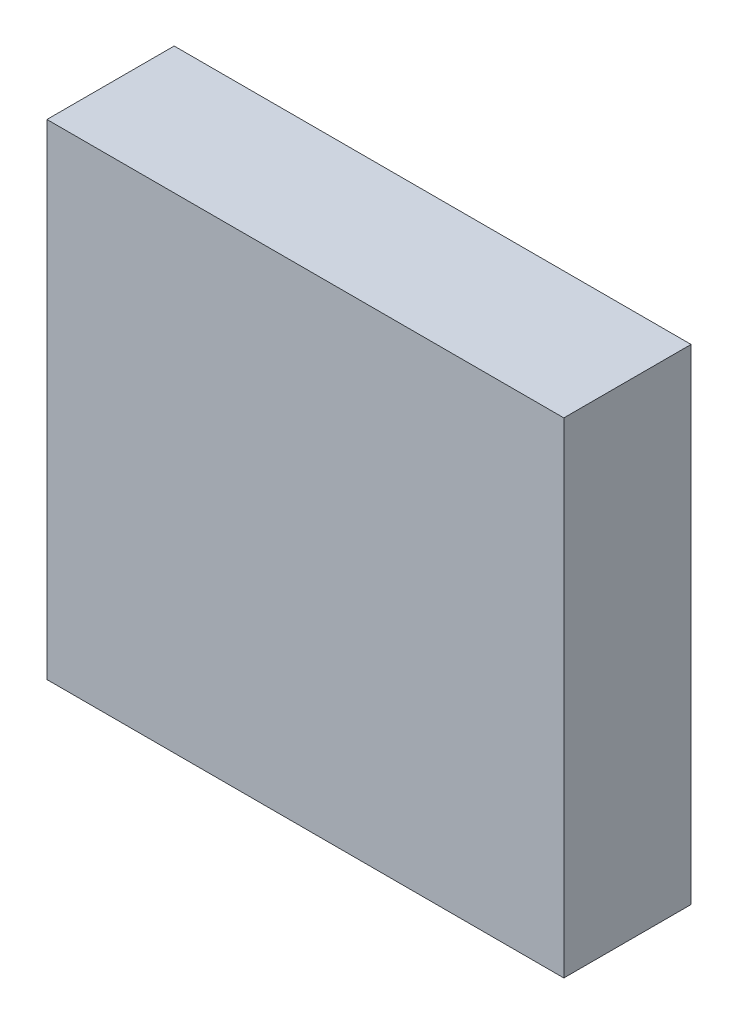
ISO-10303-21;
HEADER;
FILE_DESCRIPTION(('STEP AP214'),'2;1');
FILE_NAME('part.step','',(''),(''),'','','');
FILE_SCHEMA(('AUTOMOTIVE_DESIGN { 1 0 10303 214 1 1 1 1 }'));
ENDSEC;
DATA;
#1=APPLICATION_CONTEXT('core data for automotive mechanical design processes');
#2=APPLICATION_PROTOCOL_DEFINITION('international standard','automotive_design',2000,#1);
#3=PRODUCT_CONTEXT('',#1,'mechanical');
#4=PRODUCT('Part','Part','',(#3));
#5=PRODUCT_RELATED_PRODUCT_CATEGORY('part','',(#4));
#6=PRODUCT_DEFINITION_FORMATION('','',#4);
#7=PRODUCT_DEFINITION_CONTEXT('part definition',#1,'design');
#8=PRODUCT_DEFINITION('design','',#6,#7);
#9=PRODUCT_DEFINITION_SHAPE('','',#8);
#10=(LENGTH_UNIT() NAMED_UNIT(*) SI_UNIT(.MILLI.,.METRE.));
#11=(NAMED_UNIT(*) PLANE_ANGLE_UNIT() SI_UNIT($,.RADIAN.));
#12=(NAMED_UNIT(*) SI_UNIT($,.STERADIAN.) SOLID_ANGLE_UNIT());
#13=UNCERTAINTY_MEASURE_WITH_UNIT(LENGTH_MEASURE(1.E-05),#10,'distance_accuracy_value','');
#14=(GEOMETRIC_REPRESENTATION_CONTEXT(3) GLOBAL_UNCERTAINTY_ASSIGNED_CONTEXT((#13)) GLOBAL_UNIT_ASSIGNED_CONTEXT((#10,
#11,#12)) REPRESENTATION_CONTEXT('',''));
#15=CARTESIAN_POINT('',(0.,0.,0.));
#16=DIRECTION('',(0.,0.,1.));
#17=DIRECTION('',(1.,0.,0.));
#18=AXIS2_PLACEMENT_3D('',#15,#16,#17);
#19=CARTESIAN_POINT('',(-1.625,1.525,0.8));
#20=DIRECTION('',(1.,0.,0.));
#21=DIRECTION('',(0.,0.,-1.));
#22=AXIS2_PLACEMENT_3D('',#19,#20,#21);
#23=PLANE('',#22);
#24=DIRECTION('',(0.,-1.,0.));
#25=VECTOR('',#24,1.);
#26=CARTESIAN_POINT('',(-1.625,1.525,0.));
#27=LINE('',#26,#25);
#28=CARTESIAN_POINT('',(-1.625,1.525,0.));
#29=VERTEX_POINT('',#28);
#30=CARTESIAN_POINT('',(-1.625,-1.525,0.));
#31=VERTEX_POINT('',#30);
#32=EDGE_CURVE('E97',#29,#31,#27,.T.);
#33=ORIENTED_EDGE('',*,*,#32,.T.);
#34=DIRECTION('',(0.,0.,-1.));
#35=VECTOR('',#34,1.);
#36=CARTESIAN_POINT('',(-1.625,-1.525,0.8));
#37=LINE('',#36,#35);
#38=CARTESIAN_POINT('',(-1.625,-1.525,0.8));
#39=VERTEX_POINT('',#38);
#40=EDGE_CURVE('E11',#39,#31,#37,.T.);
#41=ORIENTED_EDGE('',*,*,#40,.F.);
#42=DIRECTION('',(0.,-1.,0.));
#43=VECTOR('',#42,1.);
#44=CARTESIAN_POINT('',(-1.625,1.525,0.8));
#45=LINE('',#44,#43);
#46=CARTESIAN_POINT('',(-1.625,1.525,0.8));
#47=VERTEX_POINT('',#46);
#48=EDGE_CURVE('E85',#47,#39,#45,.T.);
#49=ORIENTED_EDGE('',*,*,#48,.F.);
#50=DIRECTION('',(0.,0.,-1.));
#51=VECTOR('',#50,1.);
#52=CARTESIAN_POINT('',(-1.625,1.525,0.8));
#53=LINE('',#52,#51);
#54=EDGE_CURVE('E93',#47,#29,#53,.T.);
#55=ORIENTED_EDGE('',*,*,#54,.T.);
#56=EDGE_LOOP('',(#33,#41,#49,#55));
#57=FACE_BOUND('',#56,.T.);
#58=ADVANCED_FACE('F34',(#57),#23,.F.);
#59=CARTESIAN_POINT('',(-1.625,-1.525,0.8));
#60=DIRECTION('',(0.,1.,0.));
#61=DIRECTION('',(0.,0.,1.));
#62=AXIS2_PLACEMENT_3D('',#59,#60,#61);
#63=PLANE('',#62);
#64=DIRECTION('',(1.,0.,0.));
#65=VECTOR('',#64,1.);
#66=CARTESIAN_POINT('',(-1.625,-1.525,0.));
#67=LINE('',#66,#65);
#68=CARTESIAN_POINT('',(1.625,-1.525,0.));
#69=VERTEX_POINT('',#68);
#70=EDGE_CURVE('E89',#31,#69,#67,.T.);
#71=ORIENTED_EDGE('',*,*,#70,.T.);
#72=DIRECTION('',(0.,0.,-1.));
#73=VECTOR('',#72,1.);
#74=CARTESIAN_POINT('',(1.625,-1.525,0.8));
#75=LINE('',#74,#73);
#76=CARTESIAN_POINT('',(1.625,-1.525,0.8));
#77=VERTEX_POINT('',#76);
#78=EDGE_CURVE('E42',#77,#69,#75,.T.);
#79=ORIENTED_EDGE('',*,*,#78,.F.);
#80=DIRECTION('',(1.,0.,0.));
#81=VECTOR('',#80,1.);
#82=CARTESIAN_POINT('',(-1.625,-1.525,0.8));
#83=LINE('',#82,#81);
#84=EDGE_CURVE('E80',#39,#77,#83,.T.);
#85=ORIENTED_EDGE('',*,*,#84,.F.);
#86=ORIENTED_EDGE('',*,*,#40,.T.);
#87=EDGE_LOOP('',(#71,#79,#85,#86));
#88=FACE_BOUND('',#87,.T.);
#89=ADVANCED_FACE('F88',(#88),#63,.F.);
#90=CARTESIAN_POINT('',(1.625,-1.525,0.8));
#91=DIRECTION('',(-1.,0.,0.));
#92=DIRECTION('',(0.,0.,1.));
#93=AXIS2_PLACEMENT_3D('',#90,#91,#92);
#94=PLANE('',#93);
#95=DIRECTION('',(0.,1.,0.));
#96=VECTOR('',#95,1.);
#97=CARTESIAN_POINT('',(1.625,-1.525,0.));
#98=LINE('',#97,#96);
#99=CARTESIAN_POINT('',(1.625,1.525,0.));
#100=VERTEX_POINT('',#99);
#101=EDGE_CURVE('E67',#69,#100,#98,.T.);
#102=ORIENTED_EDGE('',*,*,#101,.T.);
#103=DIRECTION('',(0.,0.,-1.));
#104=VECTOR('',#103,1.);
#105=CARTESIAN_POINT('',(1.625,1.525,0.8));
#106=LINE('',#105,#104);
#107=CARTESIAN_POINT('',(1.625,1.525,0.8));
#108=VERTEX_POINT('',#107);
#109=EDGE_CURVE('E90',#108,#100,#106,.T.);
#110=ORIENTED_EDGE('',*,*,#109,.F.);
#111=DIRECTION('',(0.,1.,0.));
#112=VECTOR('',#111,1.);
#113=CARTESIAN_POINT('',(1.625,-1.525,0.8));
#114=LINE('',#113,#112);
#115=EDGE_CURVE('E83',#77,#108,#114,.T.);
#116=ORIENTED_EDGE('',*,*,#115,.F.);
#117=ORIENTED_EDGE('',*,*,#78,.T.);
#118=EDGE_LOOP('',(#102,#110,#116,#117));
#119=FACE_BOUND('',#118,.T.);
#120=ADVANCED_FACE('F91',(#119),#94,.F.);
#121=CARTESIAN_POINT('',(1.625,1.525,0.8));
#122=DIRECTION('',(0.,-1.,0.));
#123=DIRECTION('',(0.,0.,-1.));
#124=AXIS2_PLACEMENT_3D('',#121,#122,#123);
#125=PLANE('',#124);
#126=DIRECTION('',(-1.,0.,0.));
#127=VECTOR('',#126,1.);
#128=CARTESIAN_POINT('',(1.625,1.525,0.));
#129=LINE('',#128,#127);
#130=EDGE_CURVE('E73',#100,#29,#129,.T.);
#131=ORIENTED_EDGE('',*,*,#130,.T.);
#132=ORIENTED_EDGE('',*,*,#54,.F.);
#133=DIRECTION('',(-1.,0.,0.));
#134=VECTOR('',#133,1.);
#135=CARTESIAN_POINT('',(1.625,1.525,0.8));
#136=LINE('',#135,#134);
#137=EDGE_CURVE('E50',#108,#47,#136,.T.);
#138=ORIENTED_EDGE('',*,*,#137,.F.);
#139=ORIENTED_EDGE('',*,*,#109,.T.);
#140=EDGE_LOOP('',(#131,#132,#138,#139));
#141=FACE_BOUND('',#140,.T.);
#142=ADVANCED_FACE('F104',(#141),#125,.F.);
#143=CARTESIAN_POINT('',(0.,0.,0.8));
#144=DIRECTION('',(0.,0.,1.));
#145=DIRECTION('',(1.,0.,0.));
#146=AXIS2_PLACEMENT_3D('',#143,#144,#145);
#147=PLANE('',#146);
#148=ORIENTED_EDGE('',*,*,#48,.T.);
#149=ORIENTED_EDGE('',*,*,#84,.T.);
#150=ORIENTED_EDGE('',*,*,#115,.T.);
#151=ORIENTED_EDGE('',*,*,#137,.T.);
#152=EDGE_LOOP('',(#148,#149,#150,#151));
#153=FACE_BOUND('',#152,.T.);
#154=ADVANCED_FACE('F81',(#153),#147,.T.);
#155=CARTESIAN_POINT('',(0.,0.,0.));
#156=DIRECTION('',(0.,0.,1.));
#157=DIRECTION('',(1.,0.,0.));
#158=AXIS2_PLACEMENT_3D('',#155,#156,#157);
#159=PLANE('',#158);
#160=ORIENTED_EDGE('',*,*,#32,.F.);
#161=ORIENTED_EDGE('',*,*,#130,.F.);
#162=ORIENTED_EDGE('',*,*,#101,.F.);
#163=ORIENTED_EDGE('',*,*,#70,.F.);
#164=EDGE_LOOP('',(#160,#161,#162,#163));
#165=FACE_BOUND('',#164,.T.);
#166=ADVANCED_FACE('F107',(#165),#159,.F.);
#167=CLOSED_SHELL('',(#58,#89,#120,#142,#154,#166));
#168=MANIFOLD_SOLID_BREP('B2',#167);
#169=ADVANCED_BREP_SHAPE_REPRESENTATION('',(#18,#168),#14);
#170=SHAPE_DEFINITION_REPRESENTATION(#9,#169);
ENDSEC;
END-ISO-10303-21;
